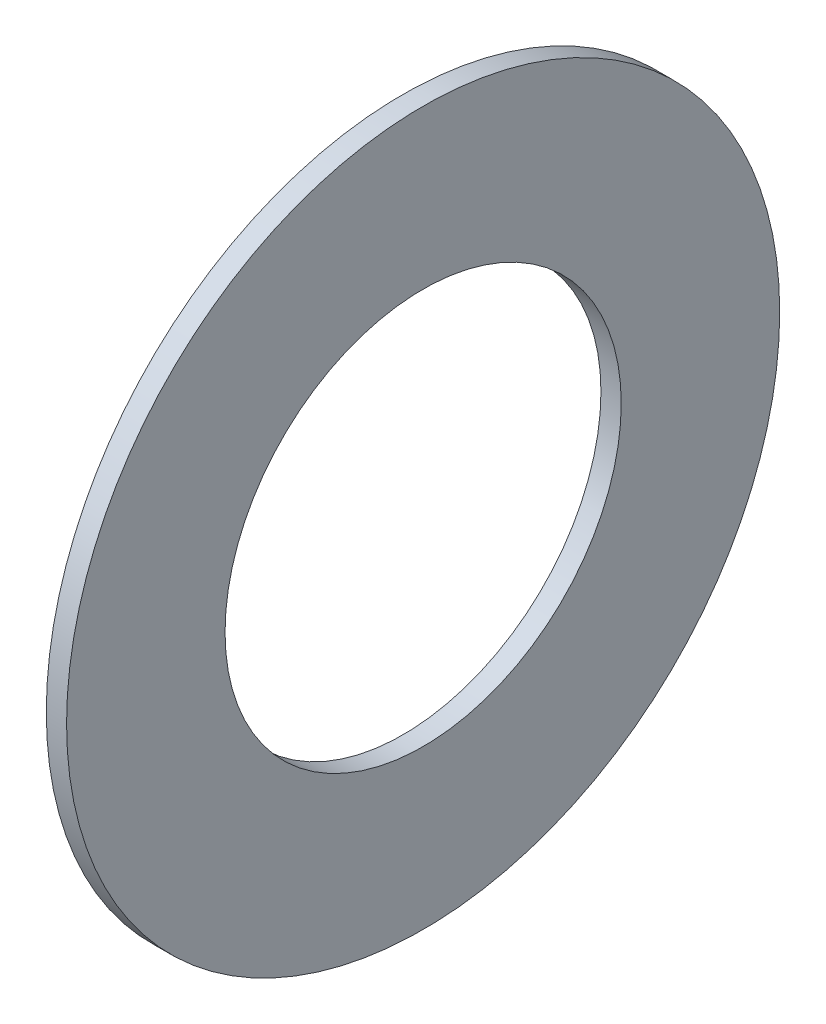
ISO-10303-21;
HEADER;
FILE_DESCRIPTION(('STEP AP214'),'2;1');
FILE_NAME('part.step','',(''),(''),'','','');
FILE_SCHEMA(('AUTOMOTIVE_DESIGN { 1 0 10303 214 1 1 1 1 }'));
ENDSEC;
DATA;
#1=APPLICATION_CONTEXT('core data for automotive mechanical design processes');
#2=APPLICATION_PROTOCOL_DEFINITION('international standard','automotive_design',2000,#1);
#3=PRODUCT_CONTEXT('',#1,'mechanical');
#4=PRODUCT('Part','Part','',(#3));
#5=PRODUCT_RELATED_PRODUCT_CATEGORY('part','',(#4));
#6=PRODUCT_DEFINITION_FORMATION('','',#4);
#7=PRODUCT_DEFINITION_CONTEXT('part definition',#1,'design');
#8=PRODUCT_DEFINITION('design','',#6,#7);
#9=PRODUCT_DEFINITION_SHAPE('','',#8);
#10=(LENGTH_UNIT() NAMED_UNIT(*) SI_UNIT(.MILLI.,.METRE.));
#11=(NAMED_UNIT(*) PLANE_ANGLE_UNIT() SI_UNIT($,.RADIAN.));
#12=(NAMED_UNIT(*) SI_UNIT($,.STERADIAN.) SOLID_ANGLE_UNIT());
#13=UNCERTAINTY_MEASURE_WITH_UNIT(LENGTH_MEASURE(1.E-05),#10,'distance_accuracy_value','');
#14=(GEOMETRIC_REPRESENTATION_CONTEXT(3) GLOBAL_UNCERTAINTY_ASSIGNED_CONTEXT((#13)) GLOBAL_UNIT_ASSIGNED_CONTEXT((#10,
#11,#12)) REPRESENTATION_CONTEXT('',''));
#15=CARTESIAN_POINT('',(0.,0.,0.));
#16=DIRECTION('',(0.,0.,1.));
#17=DIRECTION('',(1.,0.,0.));
#18=AXIS2_PLACEMENT_3D('',#15,#16,#17);
#19=CARTESIAN_POINT('',(0.8128,0.,0.));
#20=DIRECTION('',(1.,0.,0.));
#21=DIRECTION('',(0.,0.,-1.));
#22=AXIS2_PLACEMENT_3D('',#19,#20,#21);
#23=PLANE('',#22);
#24=CARTESIAN_POINT('',(0.8128,0.,0.));
#25=DIRECTION('',(1.,0.,0.));
#26=DIRECTION('',(0.,0.,-1.));
#27=AXIS2_PLACEMENT_3D('',#24,#25,#26);
#28=CIRCLE('',#27,14.2875);
#29=CARTESIAN_POINT('',(0.8128,0.,-14.2875));
#30=VERTEX_POINT('',#29);
#31=EDGE_CURVE('E10',#30,#30,#28,.T.);
#32=ORIENTED_EDGE('',*,*,#31,.T.);
#33=EDGE_LOOP('',(#32));
#34=FACE_BOUND('',#33,.T.);
#35=CARTESIAN_POINT('',(0.8128,0.,0.));
#36=DIRECTION('',(1.,0.,0.));
#37=DIRECTION('',(0.,0.,-1.));
#38=AXIS2_PLACEMENT_3D('',#35,#36,#37);
#39=CIRCLE('',#38,7.9375);
#40=CARTESIAN_POINT('',(0.8128,0.,-7.9375));
#41=VERTEX_POINT('',#40);
#42=EDGE_CURVE('E46',#41,#41,#39,.T.);
#43=ORIENTED_EDGE('',*,*,#42,.F.);
#44=EDGE_LOOP('',(#43));
#45=FACE_BOUND('',#44,.T.);
#46=ADVANCED_FACE('F35',(#34,#45),#23,.T.);
#47=CARTESIAN_POINT('',(0.,0.,0.));
#48=DIRECTION('',(1.,0.,0.));
#49=DIRECTION('',(0.,0.,-1.));
#50=AXIS2_PLACEMENT_3D('',#47,#48,#49);
#51=PLANE('',#50);
#52=CARTESIAN_POINT('',(0.,0.,0.));
#53=DIRECTION('',(1.,0.,0.));
#54=DIRECTION('',(0.,0.,-1.));
#55=AXIS2_PLACEMENT_3D('',#52,#53,#54);
#56=CIRCLE('',#55,14.2875);
#57=CARTESIAN_POINT('',(0.,0.,-14.2875));
#58=VERTEX_POINT('',#57);
#59=EDGE_CURVE('E42',#58,#58,#56,.T.);
#60=ORIENTED_EDGE('',*,*,#59,.F.);
#61=EDGE_LOOP('',(#60));
#62=FACE_BOUND('',#61,.T.);
#63=CARTESIAN_POINT('',(0.,0.,0.));
#64=DIRECTION('',(1.,0.,0.));
#65=DIRECTION('',(0.,0.,-1.));
#66=AXIS2_PLACEMENT_3D('',#63,#64,#65);
#67=CIRCLE('',#66,7.9375);
#68=CARTESIAN_POINT('',(0.,0.,-7.9375));
#69=VERTEX_POINT('',#68);
#70=EDGE_CURVE('E50',#69,#69,#67,.T.);
#71=ORIENTED_EDGE('',*,*,#70,.T.);
#72=EDGE_LOOP('',(#71));
#73=FACE_BOUND('',#72,.T.);
#74=ADVANCED_FACE('F56',(#62,#73),#51,.F.);
#75=CARTESIAN_POINT('',(0.8128,0.,0.));
#76=DIRECTION('',(-1.,0.,0.));
#77=DIRECTION('',(0.,0.,1.));
#78=AXIS2_PLACEMENT_3D('',#75,#76,#77);
#79=CYLINDRICAL_SURFACE('',#78,14.2875);
#80=ORIENTED_EDGE('',*,*,#31,.F.);
#81=EDGE_LOOP('',(#80));
#82=FACE_BOUND('',#81,.T.);
#83=ORIENTED_EDGE('',*,*,#59,.T.);
#84=EDGE_LOOP('',(#83));
#85=FACE_BOUND('',#84,.T.);
#86=ADVANCED_FACE('F37',(#82,#85),#79,.T.);
#87=CARTESIAN_POINT('',(0.8128,0.,0.));
#88=DIRECTION('',(-1.,0.,0.));
#89=DIRECTION('',(0.,0.,1.));
#90=AXIS2_PLACEMENT_3D('',#87,#88,#89);
#91=CYLINDRICAL_SURFACE('',#90,7.9375);
#92=ORIENTED_EDGE('',*,*,#42,.T.);
#93=EDGE_LOOP('',(#92));
#94=FACE_BOUND('',#93,.T.);
#95=ORIENTED_EDGE('',*,*,#70,.F.);
#96=EDGE_LOOP('',(#95));
#97=FACE_BOUND('',#96,.T.);
#98=ADVANCED_FACE('F58',(#94,#97),#91,.F.);
#99=CLOSED_SHELL('',(#46,#74,#86,#98));
#100=MANIFOLD_SOLID_BREP('B2',#99);
#101=ADVANCED_BREP_SHAPE_REPRESENTATION('',(#18,#100),#14);
#102=SHAPE_DEFINITION_REPRESENTATION(#9,#101);
ENDSEC;
END-ISO-10303-21;
